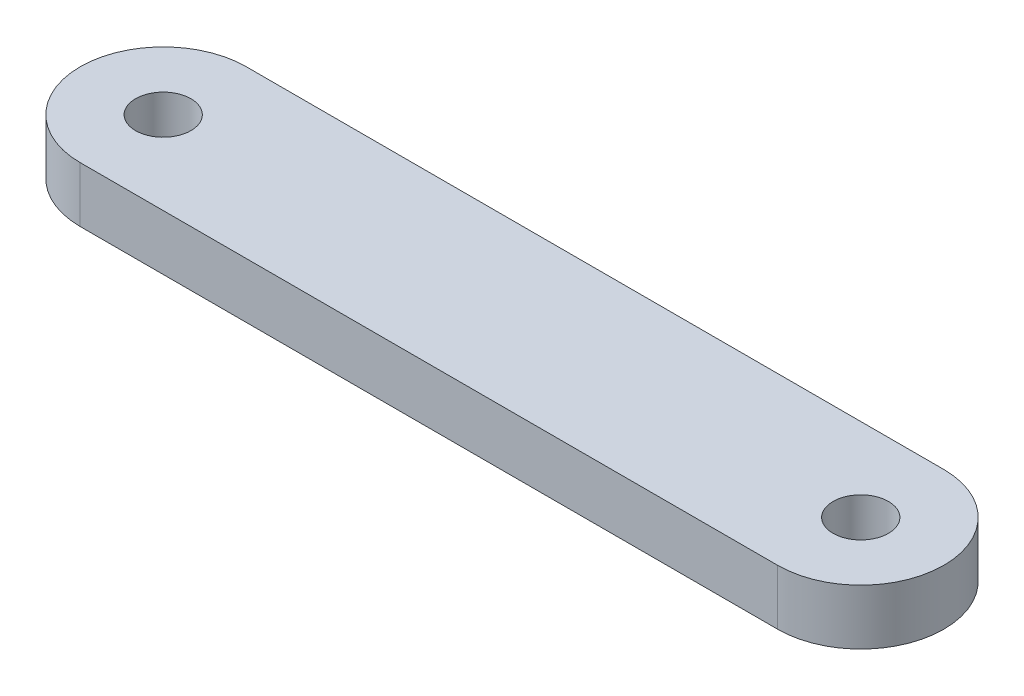
ISO-10303-21;
HEADER;
FILE_DESCRIPTION(('STEP AP214'),'2;1');
FILE_NAME('part.step','',(''),(''),'','','');
FILE_SCHEMA(('AUTOMOTIVE_DESIGN { 1 0 10303 214 1 1 1 1 }'));
ENDSEC;
DATA;
#1=APPLICATION_CONTEXT('core data for automotive mechanical design processes');
#2=APPLICATION_PROTOCOL_DEFINITION('international standard','automotive_design',2000,#1);
#3=PRODUCT_CONTEXT('',#1,'mechanical');
#4=PRODUCT('Part','Part','',(#3));
#5=PRODUCT_RELATED_PRODUCT_CATEGORY('part','',(#4));
#6=PRODUCT_DEFINITION_FORMATION('','',#4);
#7=PRODUCT_DEFINITION_CONTEXT('part definition',#1,'design');
#8=PRODUCT_DEFINITION('design','',#6,#7);
#9=PRODUCT_DEFINITION_SHAPE('','',#8);
#10=(LENGTH_UNIT() NAMED_UNIT(*) SI_UNIT(.MILLI.,.METRE.));
#11=(NAMED_UNIT(*) PLANE_ANGLE_UNIT() SI_UNIT($,.RADIAN.));
#12=(NAMED_UNIT(*) SI_UNIT($,.STERADIAN.) SOLID_ANGLE_UNIT());
#13=UNCERTAINTY_MEASURE_WITH_UNIT(LENGTH_MEASURE(1.E-05),#10,'distance_accuracy_value','');
#14=(GEOMETRIC_REPRESENTATION_CONTEXT(3) GLOBAL_UNCERTAINTY_ASSIGNED_CONTEXT((#13)) GLOBAL_UNIT_ASSIGNED_CONTEXT((#10,
#11,#12)) REPRESENTATION_CONTEXT('',''));
#15=CARTESIAN_POINT('',(0.,0.,0.));
#16=DIRECTION('',(0.,0.,1.));
#17=DIRECTION('',(1.,0.,0.));
#18=AXIS2_PLACEMENT_3D('',#15,#16,#17);
#19=CARTESIAN_POINT('',(-20.,3.175,4.7625));
#20=DIRECTION('',(0.,1.,0.));
#21=DIRECTION('',(0.,0.,1.));
#22=AXIS2_PLACEMENT_3D('',#19,#20,#21);
#23=PLANE('',#22);
#24=CARTESIAN_POINT('',(-20.,3.175,4.7625));
#25=DIRECTION('',(0.,1.,0.));
#26=DIRECTION('',(0.,0.,1.));
#27=AXIS2_PLACEMENT_3D('',#24,#25,#26);
#28=CIRCLE('',#27,1.5875);
#29=CARTESIAN_POINT('',(-20.,3.175,6.35));
#30=VERTEX_POINT('',#29);
#31=EDGE_CURVE('E99',#30,#30,#28,.T.);
#32=ORIENTED_EDGE('',*,*,#31,.F.);
#33=EDGE_LOOP('',(#32));
#34=FACE_BOUND('',#33,.T.);
#35=CARTESIAN_POINT('',(-20.,3.175,4.7625));
#36=DIRECTION('',(0.,1.,0.));
#37=DIRECTION('',(0.,0.,1.));
#38=AXIS2_PLACEMENT_3D('',#35,#36,#37);
#39=CIRCLE('',#38,4.7625);
#40=CARTESIAN_POINT('',(-20.,3.175,0.));
#41=VERTEX_POINT('',#40);
#42=CARTESIAN_POINT('',(-20.,3.175,9.525));
#43=VERTEX_POINT('',#42);
#44=EDGE_CURVE('E84',#41,#43,#39,.T.);
#45=ORIENTED_EDGE('',*,*,#44,.T.);
#46=DIRECTION('',(1.,0.,0.));
#47=VECTOR('',#46,1.);
#48=CARTESIAN_POINT('',(-20.,3.175,9.525));
#49=LINE('',#48,#47);
#50=CARTESIAN_POINT('',(20.,3.175,9.52499999999999));
#51=VERTEX_POINT('',#50);
#52=EDGE_CURVE('E79',#43,#51,#49,.T.);
#53=ORIENTED_EDGE('',*,*,#52,.T.);
#54=CARTESIAN_POINT('',(20.,3.175,4.76249999999999));
#55=DIRECTION('',(0.,1.,0.));
#56=DIRECTION('',(0.,0.,1.));
#57=AXIS2_PLACEMENT_3D('',#54,#55,#56);
#58=CIRCLE('',#57,4.7625);
#59=CARTESIAN_POINT('',(20.,3.175,0.));
#60=VERTEX_POINT('',#59);
#61=EDGE_CURVE('E82',#51,#60,#58,.T.);
#62=ORIENTED_EDGE('',*,*,#61,.T.);
#63=DIRECTION('',(-1.,0.,0.));
#64=VECTOR('',#63,1.);
#65=CARTESIAN_POINT('',(-20.,3.175,0.));
#66=LINE('',#65,#64);
#67=EDGE_CURVE('E49',#60,#41,#66,.T.);
#68=ORIENTED_EDGE('',*,*,#67,.T.);
#69=EDGE_LOOP('',(#45,#53,#62,#68));
#70=FACE_BOUND('',#69,.T.);
#71=CARTESIAN_POINT('',(20.,3.175,4.76249999999999));
#72=DIRECTION('',(0.,1.,0.));
#73=DIRECTION('',(0.,0.,1.));
#74=AXIS2_PLACEMENT_3D('',#71,#72,#73);
#75=CIRCLE('',#74,1.5875);
#76=CARTESIAN_POINT('',(20.,3.175,6.34999999999999));
#77=VERTEX_POINT('',#76);
#78=EDGE_CURVE('E114',#77,#77,#75,.T.);
#79=ORIENTED_EDGE('',*,*,#78,.F.);
#80=EDGE_LOOP('',(#79));
#81=FACE_BOUND('',#80,.T.);
#82=ADVANCED_FACE('F32',(#34,#70,#81),#23,.T.);
#83=CARTESIAN_POINT('',(-20.,0.,4.7625));
#84=DIRECTION('',(0.,1.,0.));
#85=DIRECTION('',(0.,0.,1.));
#86=AXIS2_PLACEMENT_3D('',#83,#84,#85);
#87=PLANE('',#86);
#88=CARTESIAN_POINT('',(-20.,0.,4.7625));
#89=DIRECTION('',(0.,1.,0.));
#90=DIRECTION('',(0.,0.,1.));
#91=AXIS2_PLACEMENT_3D('',#88,#89,#90);
#92=CIRCLE('',#91,1.5875);
#93=CARTESIAN_POINT('',(-20.,0.,6.35));
#94=VERTEX_POINT('',#93);
#95=EDGE_CURVE('E111',#94,#94,#92,.T.);
#96=ORIENTED_EDGE('',*,*,#95,.T.);
#97=EDGE_LOOP('',(#96));
#98=FACE_BOUND('',#97,.T.);
#99=CARTESIAN_POINT('',(-20.,0.,4.7625));
#100=DIRECTION('',(0.,1.,0.));
#101=DIRECTION('',(0.,0.,1.));
#102=AXIS2_PLACEMENT_3D('',#99,#100,#101);
#103=CIRCLE('',#102,4.7625);
#104=CARTESIAN_POINT('',(-20.,0.,0.));
#105=VERTEX_POINT('',#104);
#106=CARTESIAN_POINT('',(-20.,0.,9.525));
#107=VERTEX_POINT('',#106);
#108=EDGE_CURVE('E96',#105,#107,#103,.T.);
#109=ORIENTED_EDGE('',*,*,#108,.F.);
#110=DIRECTION('',(-1.,0.,0.));
#111=VECTOR('',#110,1.);
#112=CARTESIAN_POINT('',(-20.,0.,0.));
#113=LINE('',#112,#111);
#114=CARTESIAN_POINT('',(20.,0.,0.));
#115=VERTEX_POINT('',#114);
#116=EDGE_CURVE('E72',#115,#105,#113,.T.);
#117=ORIENTED_EDGE('',*,*,#116,.F.);
#118=CARTESIAN_POINT('',(20.,0.,4.76249999999999));
#119=DIRECTION('',(0.,1.,0.));
#120=DIRECTION('',(0.,0.,1.));
#121=AXIS2_PLACEMENT_3D('',#118,#119,#120);
#122=CIRCLE('',#121,4.7625);
#123=CARTESIAN_POINT('',(20.,0.,9.52499999999999));
#124=VERTEX_POINT('',#123);
#125=EDGE_CURVE('E66',#124,#115,#122,.T.);
#126=ORIENTED_EDGE('',*,*,#125,.F.);
#127=DIRECTION('',(1.,0.,0.));
#128=VECTOR('',#127,1.);
#129=CARTESIAN_POINT('',(-20.,0.,9.525));
#130=LINE('',#129,#128);
#131=EDGE_CURVE('E88',#107,#124,#130,.T.);
#132=ORIENTED_EDGE('',*,*,#131,.F.);
#133=EDGE_LOOP('',(#109,#117,#126,#132));
#134=FACE_BOUND('',#133,.T.);
#135=CARTESIAN_POINT('',(20.,0.,4.76249999999999));
#136=DIRECTION('',(0.,1.,0.));
#137=DIRECTION('',(0.,0.,1.));
#138=AXIS2_PLACEMENT_3D('',#135,#136,#137);
#139=CIRCLE('',#138,1.5875);
#140=CARTESIAN_POINT('',(20.,0.,6.34999999999999));
#141=VERTEX_POINT('',#140);
#142=EDGE_CURVE('E117',#141,#141,#139,.T.);
#143=ORIENTED_EDGE('',*,*,#142,.T.);
#144=EDGE_LOOP('',(#143));
#145=FACE_BOUND('',#144,.T.);
#146=ADVANCED_FACE('F107',(#98,#134,#145),#87,.F.);
#147=CARTESIAN_POINT('',(-20.,3.175,4.7625));
#148=DIRECTION('',(0.,-1.,0.));
#149=DIRECTION('',(0.,0.,-1.));
#150=AXIS2_PLACEMENT_3D('',#147,#148,#149);
#151=CYLINDRICAL_SURFACE('',#150,4.7625);
#152=ORIENTED_EDGE('',*,*,#108,.T.);
#153=DIRECTION('',(0.,-1.,0.));
#154=VECTOR('',#153,1.);
#155=CARTESIAN_POINT('',(-20.,3.175,9.525));
#156=LINE('',#155,#154);
#157=EDGE_CURVE('E11',#43,#107,#156,.T.);
#158=ORIENTED_EDGE('',*,*,#157,.F.);
#159=ORIENTED_EDGE('',*,*,#44,.F.);
#160=DIRECTION('',(0.,-1.,0.));
#161=VECTOR('',#160,1.);
#162=CARTESIAN_POINT('',(-20.,3.175,0.));
#163=LINE('',#162,#161);
#164=EDGE_CURVE('E92',#41,#105,#163,.T.);
#165=ORIENTED_EDGE('',*,*,#164,.T.);
#166=EDGE_LOOP('',(#152,#158,#159,#165));
#167=FACE_BOUND('',#166,.T.);
#168=ADVANCED_FACE('F34',(#167),#151,.T.);
#169=CARTESIAN_POINT('',(-20.,3.175,9.525));
#170=DIRECTION('',(0.,0.,-1.));
#171=DIRECTION('',(-1.,0.,0.));
#172=AXIS2_PLACEMENT_3D('',#169,#170,#171);
#173=PLANE('',#172);
#174=ORIENTED_EDGE('',*,*,#131,.T.);
#175=DIRECTION('',(0.,-1.,0.));
#176=VECTOR('',#175,1.);
#177=CARTESIAN_POINT('',(20.,3.175,9.52499999999999));
#178=LINE('',#177,#176);
#179=EDGE_CURVE('E41',#51,#124,#178,.T.);
#180=ORIENTED_EDGE('',*,*,#179,.F.);
#181=ORIENTED_EDGE('',*,*,#52,.F.);
#182=ORIENTED_EDGE('',*,*,#157,.T.);
#183=EDGE_LOOP('',(#174,#180,#181,#182));
#184=FACE_BOUND('',#183,.T.);
#185=ADVANCED_FACE('F87',(#184),#173,.F.);
#186=CARTESIAN_POINT('',(20.,3.175,4.76249999999999));
#187=DIRECTION('',(0.,-1.,0.));
#188=DIRECTION('',(0.,0.,-1.));
#189=AXIS2_PLACEMENT_3D('',#186,#187,#188);
#190=CYLINDRICAL_SURFACE('',#189,4.7625);
#191=ORIENTED_EDGE('',*,*,#125,.T.);
#192=DIRECTION('',(0.,-1.,0.));
#193=VECTOR('',#192,1.);
#194=CARTESIAN_POINT('',(20.,3.175,0.));
#195=LINE('',#194,#193);
#196=EDGE_CURVE('E89',#60,#115,#195,.T.);
#197=ORIENTED_EDGE('',*,*,#196,.F.);
#198=ORIENTED_EDGE('',*,*,#61,.F.);
#199=ORIENTED_EDGE('',*,*,#179,.T.);
#200=EDGE_LOOP('',(#191,#197,#198,#199));
#201=FACE_BOUND('',#200,.T.);
#202=ADVANCED_FACE('F90',(#201),#190,.T.);
#203=CARTESIAN_POINT('',(-20.,3.175,0.));
#204=DIRECTION('',(0.,0.,1.));
#205=DIRECTION('',(1.,0.,0.));
#206=AXIS2_PLACEMENT_3D('',#203,#204,#205);
#207=PLANE('',#206);
#208=ORIENTED_EDGE('',*,*,#116,.T.);
#209=ORIENTED_EDGE('',*,*,#164,.F.);
#210=ORIENTED_EDGE('',*,*,#67,.F.);
#211=ORIENTED_EDGE('',*,*,#196,.T.);
#212=EDGE_LOOP('',(#208,#209,#210,#211));
#213=FACE_BOUND('',#212,.T.);
#214=ADVANCED_FACE('F104',(#213),#207,.F.);
#215=CARTESIAN_POINT('',(-20.,3.175,4.7625));
#216=DIRECTION('',(0.,-1.,0.));
#217=DIRECTION('',(0.,0.,-1.));
#218=AXIS2_PLACEMENT_3D('',#215,#216,#217);
#219=CYLINDRICAL_SURFACE('',#218,1.5875);
#220=ORIENTED_EDGE('',*,*,#31,.T.);
#221=EDGE_LOOP('',(#220));
#222=FACE_BOUND('',#221,.T.);
#223=ORIENTED_EDGE('',*,*,#95,.F.);
#224=EDGE_LOOP('',(#223));
#225=FACE_BOUND('',#224,.T.);
#226=ADVANCED_FACE('F135',(#222,#225),#219,.F.);
#227=CARTESIAN_POINT('',(20.,3.175,4.76249999999999));
#228=DIRECTION('',(0.,-1.,0.));
#229=DIRECTION('',(0.,0.,-1.));
#230=AXIS2_PLACEMENT_3D('',#227,#228,#229);
#231=CYLINDRICAL_SURFACE('',#230,1.5875);
#232=ORIENTED_EDGE('',*,*,#78,.T.);
#233=EDGE_LOOP('',(#232));
#234=FACE_BOUND('',#233,.T.);
#235=ORIENTED_EDGE('',*,*,#142,.F.);
#236=EDGE_LOOP('',(#235));
#237=FACE_BOUND('',#236,.T.);
#238=ADVANCED_FACE('F123',(#234,#237),#231,.F.);
#239=CLOSED_SHELL('',(#82,#146,#168,#185,#202,#214,#226,#238));
#240=MANIFOLD_SOLID_BREP('B2',#239);
#241=ADVANCED_BREP_SHAPE_REPRESENTATION('',(#18,#240),#14);
#242=SHAPE_DEFINITION_REPRESENTATION(#9,#241);
ENDSEC;
END-ISO-10303-21;
